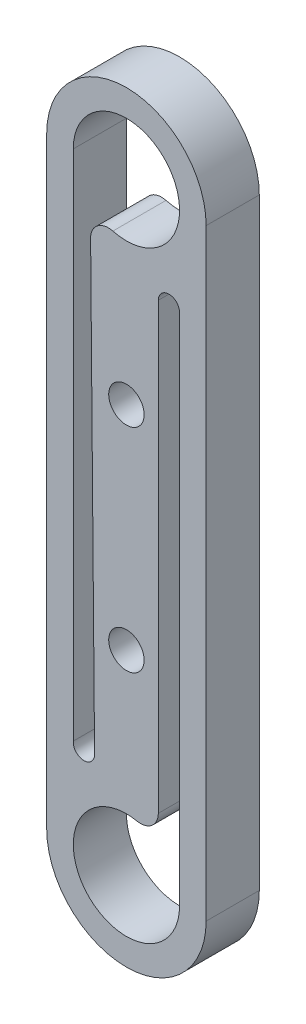
ISO-10303-21;
HEADER;
FILE_DESCRIPTION(('STEP AP214'),'2;1');
FILE_NAME('part.step','',(''),(''),'','','');
FILE_SCHEMA(('AUTOMOTIVE_DESIGN { 1 0 10303 214 1 1 1 1 }'));
ENDSEC;
DATA;
#1=APPLICATION_CONTEXT('core data for automotive mechanical design processes');
#2=APPLICATION_PROTOCOL_DEFINITION('international standard','automotive_design',2000,#1);
#3=PRODUCT_CONTEXT('',#1,'mechanical');
#4=PRODUCT('Part','Part','',(#3));
#5=PRODUCT_RELATED_PRODUCT_CATEGORY('part','',(#4));
#6=PRODUCT_DEFINITION_FORMATION('','',#4);
#7=PRODUCT_DEFINITION_CONTEXT('part definition',#1,'design');
#8=PRODUCT_DEFINITION('design','',#6,#7);
#9=PRODUCT_DEFINITION_SHAPE('','',#8);
#10=(LENGTH_UNIT() NAMED_UNIT(*) SI_UNIT(.MILLI.,.METRE.));
#11=(NAMED_UNIT(*) PLANE_ANGLE_UNIT() SI_UNIT($,.RADIAN.));
#12=(NAMED_UNIT(*) SI_UNIT($,.STERADIAN.) SOLID_ANGLE_UNIT());
#13=UNCERTAINTY_MEASURE_WITH_UNIT(LENGTH_MEASURE(1.E-05),#10,'distance_accuracy_value','');
#14=(GEOMETRIC_REPRESENTATION_CONTEXT(3) GLOBAL_UNCERTAINTY_ASSIGNED_CONTEXT((#13)) GLOBAL_UNIT_ASSIGNED_CONTEXT((#10,
#11,#12)) REPRESENTATION_CONTEXT('',''));
#15=CARTESIAN_POINT('',(0.,0.,0.));
#16=DIRECTION('',(0.,0.,1.));
#17=DIRECTION('',(1.,0.,0.));
#18=AXIS2_PLACEMENT_3D('',#15,#16,#17);
#19=CARTESIAN_POINT('',(-474.672785233275,43.7562419998984,3.));
#20=DIRECTION('',(0.,0.,1.));
#21=DIRECTION('',(1.,0.,0.));
#22=AXIS2_PLACEMENT_3D('',#19,#20,#21);
#23=PLANE('',#22);
#24=CARTESIAN_POINT('',(-474.672785233275,66.7562419998985,3.));
#25=DIRECTION('',(0.,0.,1.));
#26=DIRECTION('',(1.,0.,0.));
#27=AXIS2_PLACEMENT_3D('',#24,#25,#26);
#28=CIRCLE('',#27,0.999999999999998);
#29=CARTESIAN_POINT('',(-473.672785233275,66.7562419998985,3.));
#30=VERTEX_POINT('',#29);
#31=EDGE_CURVE('E168',#30,#30,#28,.T.);
#32=ORIENTED_EDGE('',*,*,#31,.F.);
#33=EDGE_LOOP('',(#32));
#34=FACE_BOUND('',#33,.T.);
#35=CARTESIAN_POINT('',(-474.672785233275,43.7562419998984,3.));
#36=DIRECTION('',(0.,0.,1.));
#37=DIRECTION('',(1.,0.,0.));
#38=AXIS2_PLACEMENT_3D('',#35,#36,#37);
#39=CIRCLE('',#38,4.5);
#40=CARTESIAN_POINT('',(-479.172785233275,43.7562419998985,3.));
#41=VERTEX_POINT('',#40);
#42=CARTESIAN_POINT('',(-470.172785233275,43.7562419998985,3.));
#43=VERTEX_POINT('',#42);
#44=EDGE_CURVE('E221',#41,#43,#39,.T.);
#45=ORIENTED_EDGE('',*,*,#44,.T.);
#46=DIRECTION('',(0.,1.,0.));
#47=VECTOR('',#46,1.);
#48=CARTESIAN_POINT('',(-470.172785233275,43.7562419998985,3.));
#49=LINE('',#48,#47);
#50=CARTESIAN_POINT('',(-470.172785233275,77.7562419998985,3.));
#51=VERTEX_POINT('',#50);
#52=EDGE_CURVE('E224',#43,#51,#49,.T.);
#53=ORIENTED_EDGE('',*,*,#52,.T.);
#54=CARTESIAN_POINT('',(-474.672785233275,77.7562419998985,3.));
#55=DIRECTION('',(0.,0.,1.));
#56=DIRECTION('',(1.,0.,0.));
#57=AXIS2_PLACEMENT_3D('',#54,#55,#56);
#58=CIRCLE('',#57,4.5);
#59=CARTESIAN_POINT('',(-479.172785233275,77.7562419998985,3.));
#60=VERTEX_POINT('',#59);
#61=EDGE_CURVE('E227',#51,#60,#58,.T.);
#62=ORIENTED_EDGE('',*,*,#61,.T.);
#63=DIRECTION('',(0.,-1.,0.));
#64=VECTOR('',#63,1.);
#65=CARTESIAN_POINT('',(-479.172785233275,77.7562419998985,3.));
#66=LINE('',#65,#64);
#67=EDGE_CURVE('E229',#60,#41,#66,.T.);
#68=ORIENTED_EDGE('',*,*,#67,.T.);
#69=EDGE_LOOP('',(#45,#53,#62,#68));
#70=FACE_BOUND('',#69,.T.);
#71=DIRECTION('',(0.,-1.,0.));
#72=VECTOR('',#71,1.);
#73=CARTESIAN_POINT('',(-472.873395695947,72.7562419998984,3.));
#74=LINE('',#73,#72);
#75=CARTESIAN_POINT('',(-472.873395695947,72.7562419998984,3.));
#76=VERTEX_POINT('',#75);
#77=CARTESIAN_POINT('',(-472.873395695947,47.6755501489995,3.));
#78=VERTEX_POINT('',#77);
#79=EDGE_CURVE('E185',#76,#78,#74,.T.);
#80=ORIENTED_EDGE('',*,*,#79,.F.);
#81=CARTESIAN_POINT('',(-472.272785233275,72.7562419998984,3.));
#82=DIRECTION('',(0.,0.,1.));
#83=DIRECTION('',(1.,0.,0.));
#84=AXIS2_PLACEMENT_3D('',#81,#82,#83);
#85=CIRCLE('',#84,0.600610462671603);
#86=CARTESIAN_POINT('',(-471.672174770737,72.756229356783,3.));
#87=VERTEX_POINT('',#86);
#88=EDGE_CURVE('E183',#87,#76,#85,.T.);
#89=ORIENTED_EDGE('',*,*,#88,.F.);
#90=DIRECTION('',(2.10504415335133E-05,0.999999999778439,0.));
#91=VECTOR('',#90,1.);
#92=CARTESIAN_POINT('',(-471.672785233275,43.7562419998986,3.));
#93=LINE('',#92,#91);
#94=CARTESIAN_POINT('',(-471.672785233275,43.7562419998986,3.));
#95=VERTEX_POINT('',#94);
#96=EDGE_CURVE('E193',#95,#87,#93,.T.);
#97=ORIENTED_EDGE('',*,*,#96,.F.);
#98=CARTESIAN_POINT('',(-474.672785233275,43.7562419998984,3.));
#99=DIRECTION('',(0.,0.,1.));
#100=DIRECTION('',(1.,0.,0.));
#101=AXIS2_PLACEMENT_3D('',#98,#99,#100);
#102=CIRCLE('',#101,3.00000000000001);
#103=CARTESIAN_POINT('',(-474.073243080279,46.6957231117242,3.));
#104=VERTEX_POINT('',#103);
#105=EDGE_CURVE('E190',#104,#95,#102,.T.);
#106=ORIENTED_EDGE('',*,*,#105,.F.);
#107=CARTESIAN_POINT('',(-473.873395695947,47.6755501489995,3.));
#108=DIRECTION('',(0.,0.,-1.));
#109=DIRECTION('',(1.,0.,0.));
#110=AXIS2_PLACEMENT_3D('',#107,#108,#109);
#111=CIRCLE('',#110,0.999999999999967);
#112=EDGE_CURVE('E188',#78,#104,#111,.T.);
#113=ORIENTED_EDGE('',*,*,#112,.F.);
#114=EDGE_LOOP('',(#80,#89,#97,#106,#113));
#115=FACE_BOUND('',#114,.T.);
#116=DIRECTION('',(-0.00890903049029223,0.999960313800364,0.));
#117=VECTOR('',#116,1.);
#118=CARTESIAN_POINT('',(-476.470594728618,48.7562419998985,3.));
#119=LINE('',#118,#117);
#120=CARTESIAN_POINT('',(-476.470594728618,48.7562419998985,3.));
#121=VERTEX_POINT('',#120);
#122=CARTESIAN_POINT('',(-476.694432061898,73.8800139154084,3.));
#123=VERTEX_POINT('',#122);
#124=EDGE_CURVE('E144',#121,#123,#119,.T.);
#125=ORIENTED_EDGE('',*,*,#124,.F.);
#126=CARTESIAN_POINT('',(-477.072785233275,48.7562419998985,3.));
#127=DIRECTION('',(0.,0.,1.));
#128=DIRECTION('',(1.,0.,0.));
#129=AXIS2_PLACEMENT_3D('',#126,#127,#128);
#130=CIRCLE('',#129,0.602190504656873);
#131=CARTESIAN_POINT('',(-477.672785233275,48.807558701848,3.));
#132=VERTEX_POINT('',#131);
#133=EDGE_CURVE('E136',#132,#121,#130,.T.);
#134=ORIENTED_EDGE('',*,*,#133,.F.);
#135=DIRECTION('',(0.,-1.,0.));
#136=VECTOR('',#135,1.);
#137=CARTESIAN_POINT('',(-477.672785233275,77.7562419998985,3.));
#138=LINE('',#137,#136);
#139=CARTESIAN_POINT('',(-477.672785233275,77.7562419998985,3.));
#140=VERTEX_POINT('',#139);
#141=EDGE_CURVE('E165',#140,#132,#138,.T.);
#142=ORIENTED_EDGE('',*,*,#141,.F.);
#143=CARTESIAN_POINT('',(-474.672785233275,77.7562419998985,3.));
#144=DIRECTION('',(0.,0.,1.));
#145=DIRECTION('',(1.,0.,0.));
#146=AXIS2_PLACEMENT_3D('',#143,#144,#145);
#147=CIRCLE('',#146,3.);
#148=CARTESIAN_POINT('',(-475.439050119392,74.8557527093986,3.));
#149=VERTEX_POINT('',#148);
#150=EDGE_CURVE('E160',#149,#140,#147,.T.);
#151=ORIENTED_EDGE('',*,*,#150,.F.);
#152=CARTESIAN_POINT('',(-475.694471748098,73.8889229458986,3.));
#153=DIRECTION('',(0.,0.,-1.));
#154=DIRECTION('',(1.,0.,0.));
#155=AXIS2_PLACEMENT_3D('',#152,#153,#154);
#156=CIRCLE('',#155,0.999999999999994);
#157=EDGE_CURVE('E158',#123,#149,#156,.T.);
#158=ORIENTED_EDGE('',*,*,#157,.F.);
#159=EDGE_LOOP('',(#125,#134,#142,#151,#158));
#160=FACE_BOUND('',#159,.T.);
#161=CARTESIAN_POINT('',(-474.672785233275,54.7562419998985,3.));
#162=DIRECTION('',(0.,0.,1.));
#163=DIRECTION('',(1.,0.,0.));
#164=AXIS2_PLACEMENT_3D('',#161,#162,#163);
#165=CIRCLE('',#164,0.999999999999998);
#166=CARTESIAN_POINT('',(-473.672785233275,54.7562419998985,3.));
#167=VERTEX_POINT('',#166);
#168=EDGE_CURVE('E349',#167,#167,#165,.T.);
#169=ORIENTED_EDGE('',*,*,#168,.F.);
#170=EDGE_LOOP('',(#169));
#171=FACE_BOUND('',#170,.T.);
#172=ADVANCED_FACE('F35',(#34,#70,#115,#160,#171),#23,.T.);
#173=CARTESIAN_POINT('',(-474.672785233275,43.7562419998984,0.));
#174=DIRECTION('',(0.,0.,1.));
#175=DIRECTION('',(1.,0.,0.));
#176=AXIS2_PLACEMENT_3D('',#173,#174,#175);
#177=PLANE('',#176);
#178=CARTESIAN_POINT('',(-472.272785233275,72.7562419998984,0.));
#179=DIRECTION('',(0.,0.,1.));
#180=DIRECTION('',(1.,0.,0.));
#181=AXIS2_PLACEMENT_3D('',#178,#179,#180);
#182=CIRCLE('',#181,0.600610462671603);
#183=CARTESIAN_POINT('',(-471.672174770737,72.756229356783,0.));
#184=VERTEX_POINT('',#183);
#185=CARTESIAN_POINT('',(-472.873395695947,72.7562419998984,0.));
#186=VERTEX_POINT('',#185);
#187=EDGE_CURVE('E152',#184,#186,#182,.T.);
#188=ORIENTED_EDGE('',*,*,#187,.T.);
#189=DIRECTION('',(0.,-1.,0.));
#190=VECTOR('',#189,1.);
#191=CARTESIAN_POINT('',(-472.873395695947,72.7562419998984,0.));
#192=LINE('',#191,#190);
#193=CARTESIAN_POINT('',(-472.873395695947,47.6755501489995,0.));
#194=VERTEX_POINT('',#193);
#195=EDGE_CURVE('E198',#186,#194,#192,.T.);
#196=ORIENTED_EDGE('',*,*,#195,.T.);
#197=CARTESIAN_POINT('',(-473.873395695947,47.6755501489995,0.));
#198=DIRECTION('',(0.,0.,-1.));
#199=DIRECTION('',(1.,0.,0.));
#200=AXIS2_PLACEMENT_3D('',#197,#198,#199);
#201=CIRCLE('',#200,0.999999999999967);
#202=CARTESIAN_POINT('',(-474.073243080279,46.6957231117242,0.));
#203=VERTEX_POINT('',#202);
#204=EDGE_CURVE('E201',#194,#203,#201,.T.);
#205=ORIENTED_EDGE('',*,*,#204,.T.);
#206=CARTESIAN_POINT('',(-474.672785233275,43.7562419998984,0.));
#207=DIRECTION('',(0.,0.,1.));
#208=DIRECTION('',(1.,0.,0.));
#209=AXIS2_PLACEMENT_3D('',#206,#207,#208);
#210=CIRCLE('',#209,3.00000000000001);
#211=CARTESIAN_POINT('',(-471.672785233275,43.7562419998986,0.));
#212=VERTEX_POINT('',#211);
#213=EDGE_CURVE('E204',#203,#212,#210,.T.);
#214=ORIENTED_EDGE('',*,*,#213,.T.);
#215=DIRECTION('',(2.10504415335133E-05,0.999999999778439,0.));
#216=VECTOR('',#215,1.);
#217=CARTESIAN_POINT('',(-471.672785233275,43.7562419998986,0.));
#218=LINE('',#217,#216);
#219=EDGE_CURVE('E186',#212,#184,#218,.T.);
#220=ORIENTED_EDGE('',*,*,#219,.T.);
#221=EDGE_LOOP('',(#188,#196,#205,#214,#220));
#222=FACE_BOUND('',#221,.T.);
#223=CARTESIAN_POINT('',(-474.672785233275,43.7562419998984,0.));
#224=DIRECTION('',(0.,0.,1.));
#225=DIRECTION('',(1.,0.,0.));
#226=AXIS2_PLACEMENT_3D('',#223,#224,#225);
#227=CIRCLE('',#226,4.5);
#228=CARTESIAN_POINT('',(-479.172785233275,43.7562419998985,0.));
#229=VERTEX_POINT('',#228);
#230=CARTESIAN_POINT('',(-470.172785233275,43.7562419998985,0.));
#231=VERTEX_POINT('',#230);
#232=EDGE_CURVE('E220',#229,#231,#227,.T.);
#233=ORIENTED_EDGE('',*,*,#232,.F.);
#234=DIRECTION('',(0.,-1.,0.));
#235=VECTOR('',#234,1.);
#236=CARTESIAN_POINT('',(-479.172785233275,77.7562419998985,0.));
#237=LINE('',#236,#235);
#238=CARTESIAN_POINT('',(-479.172785233275,77.7562419998985,0.));
#239=VERTEX_POINT('',#238);
#240=EDGE_CURVE('E225',#239,#229,#237,.T.);
#241=ORIENTED_EDGE('',*,*,#240,.F.);
#242=CARTESIAN_POINT('',(-474.672785233275,77.7562419998985,0.));
#243=DIRECTION('',(0.,0.,1.));
#244=DIRECTION('',(1.,0.,0.));
#245=AXIS2_PLACEMENT_3D('',#242,#243,#244);
#246=CIRCLE('',#245,4.5);
#247=CARTESIAN_POINT('',(-470.172785233275,77.7562419998985,0.));
#248=VERTEX_POINT('',#247);
#249=EDGE_CURVE('E236',#248,#239,#246,.T.);
#250=ORIENTED_EDGE('',*,*,#249,.F.);
#251=DIRECTION('',(0.,1.,0.));
#252=VECTOR('',#251,1.);
#253=CARTESIAN_POINT('',(-470.172785233275,43.7562419998985,0.));
#254=LINE('',#253,#252);
#255=EDGE_CURVE('E234',#231,#248,#254,.T.);
#256=ORIENTED_EDGE('',*,*,#255,.F.);
#257=EDGE_LOOP('',(#233,#241,#250,#256));
#258=FACE_BOUND('',#257,.T.);
#259=CARTESIAN_POINT('',(-477.072785233275,48.7562419998985,0.));
#260=DIRECTION('',(0.,0.,1.));
#261=DIRECTION('',(1.,0.,0.));
#262=AXIS2_PLACEMENT_3D('',#259,#260,#261);
#263=CIRCLE('',#262,0.602190504656873);
#264=CARTESIAN_POINT('',(-477.672785233275,48.807558701848,0.));
#265=VERTEX_POINT('',#264);
#266=CARTESIAN_POINT('',(-476.470594728618,48.7562419998985,0.));
#267=VERTEX_POINT('',#266);
#268=EDGE_CURVE('E58',#265,#267,#263,.T.);
#269=ORIENTED_EDGE('',*,*,#268,.T.);
#270=DIRECTION('',(-0.00890903049029223,0.999960313800364,0.));
#271=VECTOR('',#270,1.);
#272=CARTESIAN_POINT('',(-476.470594728618,48.7562419998985,0.));
#273=LINE('',#272,#271);
#274=CARTESIAN_POINT('',(-476.694432061898,73.8800139154084,0.));
#275=VERTEX_POINT('',#274);
#276=EDGE_CURVE('E151',#267,#275,#273,.T.);
#277=ORIENTED_EDGE('',*,*,#276,.T.);
#278=CARTESIAN_POINT('',(-475.694471748098,73.8889229458986,0.));
#279=DIRECTION('',(0.,0.,-1.));
#280=DIRECTION('',(1.,0.,0.));
#281=AXIS2_PLACEMENT_3D('',#278,#279,#280);
#282=CIRCLE('',#281,0.999999999999994);
#283=CARTESIAN_POINT('',(-475.439050119392,74.8557527093986,0.));
#284=VERTEX_POINT('',#283);
#285=EDGE_CURVE('E170',#275,#284,#282,.T.);
#286=ORIENTED_EDGE('',*,*,#285,.T.);
#287=CARTESIAN_POINT('',(-474.672785233275,77.7562419998985,0.));
#288=DIRECTION('',(0.,0.,1.));
#289=DIRECTION('',(1.,0.,0.));
#290=AXIS2_PLACEMENT_3D('',#287,#288,#289);
#291=CIRCLE('',#290,3.);
#292=CARTESIAN_POINT('',(-477.672785233275,77.7562419998985,0.));
#293=VERTEX_POINT('',#292);
#294=EDGE_CURVE('E173',#284,#293,#291,.T.);
#295=ORIENTED_EDGE('',*,*,#294,.T.);
#296=DIRECTION('',(0.,-1.,0.));
#297=VECTOR('',#296,1.);
#298=CARTESIAN_POINT('',(-477.672785233275,77.7562419998985,0.));
#299=LINE('',#298,#297);
#300=EDGE_CURVE('E145',#293,#265,#299,.T.);
#301=ORIENTED_EDGE('',*,*,#300,.T.);
#302=EDGE_LOOP('',(#269,#277,#286,#295,#301));
#303=FACE_BOUND('',#302,.T.);
#304=CARTESIAN_POINT('',(-474.672785233275,66.7562419998985,0.));
#305=DIRECTION('',(0.,0.,1.));
#306=DIRECTION('',(1.,0.,0.));
#307=AXIS2_PLACEMENT_3D('',#304,#305,#306);
#308=CIRCLE('',#307,0.999999999999998);
#309=CARTESIAN_POINT('',(-473.672785233275,66.7562419998985,0.));
#310=VERTEX_POINT('',#309);
#311=EDGE_CURVE('E355',#310,#310,#308,.T.);
#312=ORIENTED_EDGE('',*,*,#311,.T.);
#313=EDGE_LOOP('',(#312));
#314=FACE_BOUND('',#313,.T.);
#315=CARTESIAN_POINT('',(-474.672785233275,54.7562419998985,0.));
#316=DIRECTION('',(0.,0.,1.));
#317=DIRECTION('',(1.,0.,0.));
#318=AXIS2_PLACEMENT_3D('',#315,#316,#317);
#319=CIRCLE('',#318,0.999999999999998);
#320=CARTESIAN_POINT('',(-473.672785233275,54.7562419998985,0.));
#321=VERTEX_POINT('',#320);
#322=EDGE_CURVE('E352',#321,#321,#319,.T.);
#323=ORIENTED_EDGE('',*,*,#322,.T.);
#324=EDGE_LOOP('',(#323));
#325=FACE_BOUND('',#324,.T.);
#326=ADVANCED_FACE('F254',(#222,#258,#303,#314,#325),#177,.F.);
#327=CARTESIAN_POINT('',(-474.672785233275,43.7562419998984,3.));
#328=DIRECTION('',(0.,0.,-1.));
#329=DIRECTION('',(-1.,0.,0.));
#330=AXIS2_PLACEMENT_3D('',#327,#328,#329);
#331=CYLINDRICAL_SURFACE('',#330,4.5);
#332=ORIENTED_EDGE('',*,*,#232,.T.);
#333=DIRECTION('',(0.,0.,-1.));
#334=VECTOR('',#333,1.);
#335=CARTESIAN_POINT('',(-470.172785233275,43.7562419998985,3.));
#336=LINE('',#335,#334);
#337=EDGE_CURVE('E11',#43,#231,#336,.T.);
#338=ORIENTED_EDGE('',*,*,#337,.F.);
#339=ORIENTED_EDGE('',*,*,#44,.F.);
#340=DIRECTION('',(0.,0.,-1.));
#341=VECTOR('',#340,1.);
#342=CARTESIAN_POINT('',(-479.172785233275,43.7562419998985,3.));
#343=LINE('',#342,#341);
#344=EDGE_CURVE('E231',#41,#229,#343,.T.);
#345=ORIENTED_EDGE('',*,*,#344,.T.);
#346=EDGE_LOOP('',(#332,#338,#339,#345));
#347=FACE_BOUND('',#346,.T.);
#348=ADVANCED_FACE('F37',(#347),#331,.T.);
#349=CARTESIAN_POINT('',(-470.172785233275,43.7562419998985,3.));
#350=DIRECTION('',(-1.,0.,0.));
#351=DIRECTION('',(0.,0.,1.));
#352=AXIS2_PLACEMENT_3D('',#349,#350,#351);
#353=PLANE('',#352);
#354=ORIENTED_EDGE('',*,*,#255,.T.);
#355=DIRECTION('',(0.,0.,-1.));
#356=VECTOR('',#355,1.);
#357=CARTESIAN_POINT('',(-470.172785233275,77.7562419998985,3.));
#358=LINE('',#357,#356);
#359=EDGE_CURVE('E43',#51,#248,#358,.T.);
#360=ORIENTED_EDGE('',*,*,#359,.F.);
#361=ORIENTED_EDGE('',*,*,#52,.F.);
#362=ORIENTED_EDGE('',*,*,#337,.T.);
#363=EDGE_LOOP('',(#354,#360,#361,#362));
#364=FACE_BOUND('',#363,.T.);
#365=ADVANCED_FACE('F265',(#364),#353,.F.);
#366=CARTESIAN_POINT('',(-474.672785233275,77.7562419998985,3.));
#367=DIRECTION('',(0.,0.,-1.));
#368=DIRECTION('',(-1.,0.,0.));
#369=AXIS2_PLACEMENT_3D('',#366,#367,#368);
#370=CYLINDRICAL_SURFACE('',#369,4.5);
#371=ORIENTED_EDGE('',*,*,#249,.T.);
#372=DIRECTION('',(0.,0.,-1.));
#373=VECTOR('',#372,1.);
#374=CARTESIAN_POINT('',(-479.172785233275,77.7562419998985,3.));
#375=LINE('',#374,#373);
#376=EDGE_CURVE('E241',#60,#239,#375,.T.);
#377=ORIENTED_EDGE('',*,*,#376,.F.);
#378=ORIENTED_EDGE('',*,*,#61,.F.);
#379=ORIENTED_EDGE('',*,*,#359,.T.);
#380=EDGE_LOOP('',(#371,#377,#378,#379));
#381=FACE_BOUND('',#380,.T.);
#382=ADVANCED_FACE('F248',(#381),#370,.T.);
#383=CARTESIAN_POINT('',(-479.172785233275,77.7562419998985,3.));
#384=DIRECTION('',(1.,0.,0.));
#385=DIRECTION('',(0.,0.,-1.));
#386=AXIS2_PLACEMENT_3D('',#383,#384,#385);
#387=PLANE('',#386);
#388=ORIENTED_EDGE('',*,*,#240,.T.);
#389=ORIENTED_EDGE('',*,*,#344,.F.);
#390=ORIENTED_EDGE('',*,*,#67,.F.);
#391=ORIENTED_EDGE('',*,*,#376,.T.);
#392=EDGE_LOOP('',(#388,#389,#390,#391));
#393=FACE_BOUND('',#392,.T.);
#394=ADVANCED_FACE('F258',(#393),#387,.F.);
#395=CARTESIAN_POINT('',(-472.272785233275,72.7562419998984,3.));
#396=DIRECTION('',(0.,0.,-1.));
#397=DIRECTION('',(-1.,0.,0.));
#398=AXIS2_PLACEMENT_3D('',#395,#396,#397);
#399=CYLINDRICAL_SURFACE('',#398,0.600610462671603);
#400=ORIENTED_EDGE('',*,*,#187,.F.);
#401=DIRECTION('',(0.,0.,-1.));
#402=VECTOR('',#401,1.);
#403=CARTESIAN_POINT('',(-471.672174770737,72.756229356783,3.));
#404=LINE('',#403,#402);
#405=EDGE_CURVE('E195',#87,#184,#404,.T.);
#406=ORIENTED_EDGE('',*,*,#405,.F.);
#407=ORIENTED_EDGE('',*,*,#88,.T.);
#408=DIRECTION('',(0.,0.,-1.));
#409=VECTOR('',#408,1.);
#410=CARTESIAN_POINT('',(-472.873395695947,72.7562419998984,3.));
#411=LINE('',#410,#409);
#412=EDGE_CURVE('E217',#76,#186,#411,.T.);
#413=ORIENTED_EDGE('',*,*,#412,.T.);
#414=EDGE_LOOP('',(#400,#406,#407,#413));
#415=FACE_BOUND('',#414,.T.);
#416=ADVANCED_FACE('F282',(#415),#399,.F.);
#417=CARTESIAN_POINT('',(-472.873395695947,72.7562419998984,3.));
#418=DIRECTION('',(1.,0.,0.));
#419=DIRECTION('',(0.,1.,0.));
#420=AXIS2_PLACEMENT_3D('',#417,#418,#419);
#421=PLANE('',#420);
#422=ORIENTED_EDGE('',*,*,#195,.F.);
#423=ORIENTED_EDGE('',*,*,#412,.F.);
#424=ORIENTED_EDGE('',*,*,#79,.T.);
#425=DIRECTION('',(0.,0.,-1.));
#426=VECTOR('',#425,1.);
#427=CARTESIAN_POINT('',(-472.873395695947,47.6755501489995,3.));
#428=LINE('',#427,#426);
#429=EDGE_CURVE('E215',#78,#194,#428,.T.);
#430=ORIENTED_EDGE('',*,*,#429,.T.);
#431=EDGE_LOOP('',(#422,#423,#424,#430));
#432=FACE_BOUND('',#431,.T.);
#433=ADVANCED_FACE('F289',(#432),#421,.T.);
#434=CARTESIAN_POINT('',(-473.873395695947,47.6755501489995,3.));
#435=DIRECTION('',(0.,0.,-1.));
#436=DIRECTION('',(-1.,0.,0.));
#437=AXIS2_PLACEMENT_3D('',#434,#435,#436);
#438=CYLINDRICAL_SURFACE('',#437,0.999999999999967);
#439=ORIENTED_EDGE('',*,*,#204,.F.);
#440=ORIENTED_EDGE('',*,*,#429,.F.);
#441=ORIENTED_EDGE('',*,*,#112,.T.);
#442=DIRECTION('',(0.,0.,-1.));
#443=VECTOR('',#442,1.);
#444=CARTESIAN_POINT('',(-474.073243080279,46.6957231117242,3.));
#445=LINE('',#444,#443);
#446=EDGE_CURVE('E213',#104,#203,#445,.T.);
#447=ORIENTED_EDGE('',*,*,#446,.T.);
#448=EDGE_LOOP('',(#439,#440,#441,#447));
#449=FACE_BOUND('',#448,.T.);
#450=ADVANCED_FACE('F294',(#449),#438,.T.);
#451=CARTESIAN_POINT('',(-474.672785233275,43.7562419998984,3.));
#452=DIRECTION('',(0.,0.,-1.));
#453=DIRECTION('',(-1.,0.,0.));
#454=AXIS2_PLACEMENT_3D('',#451,#452,#453);
#455=CYLINDRICAL_SURFACE('',#454,3.00000000000001);
#456=ORIENTED_EDGE('',*,*,#213,.F.);
#457=ORIENTED_EDGE('',*,*,#446,.F.);
#458=ORIENTED_EDGE('',*,*,#105,.T.);
#459=DIRECTION('',(0.,0.,-1.));
#460=VECTOR('',#459,1.);
#461=CARTESIAN_POINT('',(-471.672785233275,43.7562419998986,3.));
#462=LINE('',#461,#460);
#463=EDGE_CURVE('E211',#95,#212,#462,.T.);
#464=ORIENTED_EDGE('',*,*,#463,.T.);
#465=EDGE_LOOP('',(#456,#457,#458,#464));
#466=FACE_BOUND('',#465,.T.);
#467=ADVANCED_FACE('F307',(#466),#455,.F.);
#468=CARTESIAN_POINT('',(-471.672785233275,43.7562419998986,3.));
#469=DIRECTION('',(-0.999999999778439,2.10504415335133E-05,0.));
#470=DIRECTION('',(-2.10504415335133E-05,-0.99999999977844,0.));
#471=AXIS2_PLACEMENT_3D('',#468,#469,#470);
#472=PLANE('',#471);
#473=ORIENTED_EDGE('',*,*,#219,.F.);
#474=ORIENTED_EDGE('',*,*,#463,.F.);
#475=ORIENTED_EDGE('',*,*,#96,.T.);
#476=ORIENTED_EDGE('',*,*,#405,.T.);
#477=EDGE_LOOP('',(#473,#474,#475,#476));
#478=FACE_BOUND('',#477,.T.);
#479=ADVANCED_FACE('F301',(#478),#472,.T.);
#480=CARTESIAN_POINT('',(-477.072785233275,48.7562419998985,3.));
#481=DIRECTION('',(0.,0.,-1.));
#482=DIRECTION('',(-1.,0.,0.));
#483=AXIS2_PLACEMENT_3D('',#480,#481,#482);
#484=CYLINDRICAL_SURFACE('',#483,0.602190504656873);
#485=ORIENTED_EDGE('',*,*,#268,.F.);
#486=DIRECTION('',(0.,0.,-1.));
#487=VECTOR('',#486,1.);
#488=CARTESIAN_POINT('',(-477.672785233275,48.807558701848,3.));
#489=LINE('',#488,#487);
#490=EDGE_CURVE('E140',#132,#265,#489,.T.);
#491=ORIENTED_EDGE('',*,*,#490,.F.);
#492=ORIENTED_EDGE('',*,*,#133,.T.);
#493=DIRECTION('',(0.,0.,-1.));
#494=VECTOR('',#493,1.);
#495=CARTESIAN_POINT('',(-476.470594728618,48.7562419998985,3.));
#496=LINE('',#495,#494);
#497=EDGE_CURVE('E139',#121,#267,#496,.T.);
#498=ORIENTED_EDGE('',*,*,#497,.T.);
#499=EDGE_LOOP('',(#485,#491,#492,#498));
#500=FACE_BOUND('',#499,.T.);
#501=ADVANCED_FACE('F138',(#500),#484,.F.);
#502=CARTESIAN_POINT('',(-476.470594728618,48.7562419998985,3.));
#503=DIRECTION('',(-0.999960313800364,-0.00890903049029223,0.));
#504=DIRECTION('',(0.00890903049029223,-0.999960313800364,0.));
#505=AXIS2_PLACEMENT_3D('',#502,#503,#504);
#506=PLANE('',#505);
#507=ORIENTED_EDGE('',*,*,#276,.F.);
#508=ORIENTED_EDGE('',*,*,#497,.F.);
#509=ORIENTED_EDGE('',*,*,#124,.T.);
#510=DIRECTION('',(0.,0.,-1.));
#511=VECTOR('',#510,1.);
#512=CARTESIAN_POINT('',(-476.694432061898,73.8800139154084,3.));
#513=LINE('',#512,#511);
#514=EDGE_CURVE('E153',#123,#275,#513,.T.);
#515=ORIENTED_EDGE('',*,*,#514,.T.);
#516=EDGE_LOOP('',(#507,#508,#509,#515));
#517=FACE_BOUND('',#516,.T.);
#518=ADVANCED_FACE('F148',(#517),#506,.T.);
#519=CARTESIAN_POINT('',(-475.694471748098,73.8889229458986,3.));
#520=DIRECTION('',(0.,0.,-1.));
#521=DIRECTION('',(-1.,0.,0.));
#522=AXIS2_PLACEMENT_3D('',#519,#520,#521);
#523=CYLINDRICAL_SURFACE('',#522,0.999999999999994);
#524=ORIENTED_EDGE('',*,*,#285,.F.);
#525=ORIENTED_EDGE('',*,*,#514,.F.);
#526=ORIENTED_EDGE('',*,*,#157,.T.);
#527=DIRECTION('',(0.,0.,-1.));
#528=VECTOR('',#527,1.);
#529=CARTESIAN_POINT('',(-475.439050119392,74.8557527093986,3.));
#530=LINE('',#529,#528);
#531=EDGE_CURVE('E180',#149,#284,#530,.T.);
#532=ORIENTED_EDGE('',*,*,#531,.T.);
#533=EDGE_LOOP('',(#524,#525,#526,#532));
#534=FACE_BOUND('',#533,.T.);
#535=ADVANCED_FACE('F326',(#534),#523,.T.);
#536=CARTESIAN_POINT('',(-474.672785233275,77.7562419998985,3.));
#537=DIRECTION('',(0.,0.,-1.));
#538=DIRECTION('',(-1.,0.,0.));
#539=AXIS2_PLACEMENT_3D('',#536,#537,#538);
#540=CYLINDRICAL_SURFACE('',#539,3.);
#541=ORIENTED_EDGE('',*,*,#294,.F.);
#542=ORIENTED_EDGE('',*,*,#531,.F.);
#543=ORIENTED_EDGE('',*,*,#150,.T.);
#544=DIRECTION('',(0.,0.,-1.));
#545=VECTOR('',#544,1.);
#546=CARTESIAN_POINT('',(-477.672785233275,77.7562419998985,3.));
#547=LINE('',#546,#545);
#548=EDGE_CURVE('E50',#140,#293,#547,.T.);
#549=ORIENTED_EDGE('',*,*,#548,.T.);
#550=EDGE_LOOP('',(#541,#542,#543,#549));
#551=FACE_BOUND('',#550,.T.);
#552=ADVANCED_FACE('F329',(#551),#540,.F.);
#553=CARTESIAN_POINT('',(-477.672785233275,77.7562419998985,3.));
#554=DIRECTION('',(1.,0.,0.));
#555=DIRECTION('',(0.,0.,-1.));
#556=AXIS2_PLACEMENT_3D('',#553,#554,#555);
#557=PLANE('',#556);
#558=ORIENTED_EDGE('',*,*,#300,.F.);
#559=ORIENTED_EDGE('',*,*,#548,.F.);
#560=ORIENTED_EDGE('',*,*,#141,.T.);
#561=ORIENTED_EDGE('',*,*,#490,.T.);
#562=EDGE_LOOP('',(#558,#559,#560,#561));
#563=FACE_BOUND('',#562,.T.);
#564=ADVANCED_FACE('F333',(#563),#557,.T.);
#565=CARTESIAN_POINT('',(-474.672785233275,66.7562419998985,3.));
#566=DIRECTION('',(0.,0.,-1.));
#567=DIRECTION('',(-1.,0.,0.));
#568=AXIS2_PLACEMENT_3D('',#565,#566,#567);
#569=CYLINDRICAL_SURFACE('',#568,0.999999999999998);
#570=ORIENTED_EDGE('',*,*,#31,.T.);
#571=EDGE_LOOP('',(#570));
#572=FACE_BOUND('',#571,.T.);
#573=ORIENTED_EDGE('',*,*,#311,.F.);
#574=EDGE_LOOP('',(#573));
#575=FACE_BOUND('',#574,.T.);
#576=ADVANCED_FACE('F337',(#572,#575),#569,.F.);
#577=CARTESIAN_POINT('',(-474.672785233275,54.7562419998985,3.));
#578=DIRECTION('',(0.,0.,-1.));
#579=DIRECTION('',(-1.,0.,0.));
#580=AXIS2_PLACEMENT_3D('',#577,#578,#579);
#581=CYLINDRICAL_SURFACE('',#580,0.999999999999998);
#582=ORIENTED_EDGE('',*,*,#168,.T.);
#583=EDGE_LOOP('',(#582));
#584=FACE_BOUND('',#583,.T.);
#585=ORIENTED_EDGE('',*,*,#322,.F.);
#586=EDGE_LOOP('',(#585));
#587=FACE_BOUND('',#586,.T.);
#588=ADVANCED_FACE('F340',(#584,#587),#581,.F.);
#589=CLOSED_SHELL('',(#172,#326,#348,#365,#382,#394,#416,#433,#450,#467,#479,#501,#518,#535,
#552,#564,#576,#588));
#590=MANIFOLD_SOLID_BREP('B2',#589);
#591=ADVANCED_BREP_SHAPE_REPRESENTATION('',(#18,#590),#14);
#592=SHAPE_DEFINITION_REPRESENTATION(#9,#591);
ENDSEC;
END-ISO-10303-21;
